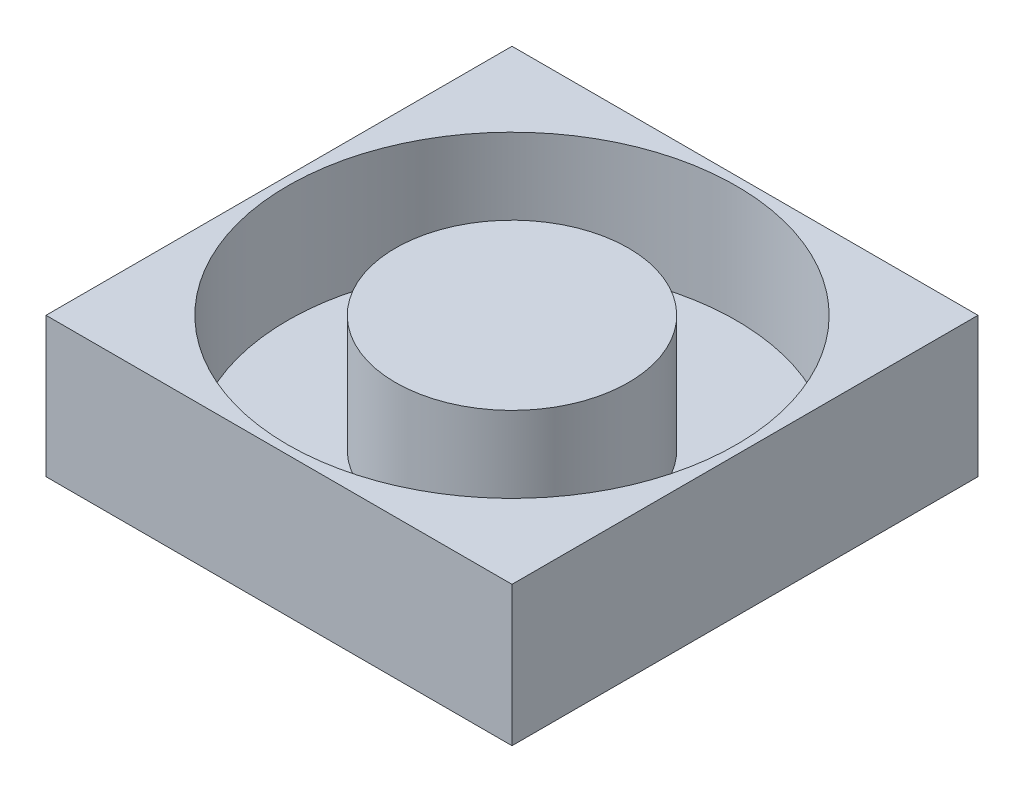
ISO-10303-21;
HEADER;
FILE_DESCRIPTION(('STEP AP214'),'2;1');
FILE_NAME('part.step','',(''),(''),'','','');
FILE_SCHEMA(('AUTOMOTIVE_DESIGN { 1 0 10303 214 1 1 1 1 }'));
ENDSEC;
DATA;
#1=APPLICATION_CONTEXT('core data for automotive mechanical design processes');
#2=APPLICATION_PROTOCOL_DEFINITION('international standard','automotive_design',2000,#1);
#3=PRODUCT_CONTEXT('',#1,'mechanical');
#4=PRODUCT('Part','Part','',(#3));
#5=PRODUCT_RELATED_PRODUCT_CATEGORY('part','',(#4));
#6=PRODUCT_DEFINITION_FORMATION('','',#4);
#7=PRODUCT_DEFINITION_CONTEXT('part definition',#1,'design');
#8=PRODUCT_DEFINITION('design','',#6,#7);
#9=PRODUCT_DEFINITION_SHAPE('','',#8);
#10=(LENGTH_UNIT() NAMED_UNIT(*) SI_UNIT(.MILLI.,.METRE.));
#11=(NAMED_UNIT(*) PLANE_ANGLE_UNIT() SI_UNIT($,.RADIAN.));
#12=(NAMED_UNIT(*) SI_UNIT($,.STERADIAN.) SOLID_ANGLE_UNIT());
#13=UNCERTAINTY_MEASURE_WITH_UNIT(LENGTH_MEASURE(1.E-05),#10,'distance_accuracy_value','');
#14=(GEOMETRIC_REPRESENTATION_CONTEXT(3) GLOBAL_UNCERTAINTY_ASSIGNED_CONTEXT((#13)) GLOBAL_UNIT_ASSIGNED_CONTEXT((#10,
#11,#12)) REPRESENTATION_CONTEXT('',''));
#15=CARTESIAN_POINT('',(0.,0.,0.));
#16=DIRECTION('',(0.,0.,1.));
#17=DIRECTION('',(1.,0.,0.));
#18=AXIS2_PLACEMENT_3D('',#15,#16,#17);
#19=CARTESIAN_POINT('',(0.,12.,0.));
#20=DIRECTION('',(1.,0.,0.));
#21=DIRECTION('',(0.,0.,-1.));
#22=AXIS2_PLACEMENT_3D('',#19,#20,#21);
#23=PLANE('',#22);
#24=DIRECTION('',(0.,0.,1.));
#25=VECTOR('',#24,1.);
#26=CARTESIAN_POINT('',(0.,0.,0.));
#27=LINE('',#26,#25);
#28=CARTESIAN_POINT('',(0.,0.,0.));
#29=VERTEX_POINT('',#28);
#30=CARTESIAN_POINT('',(0.,0.,40.));
#31=VERTEX_POINT('',#30);
#32=EDGE_CURVE('E96',#29,#31,#27,.T.);
#33=ORIENTED_EDGE('',*,*,#32,.T.);
#34=DIRECTION('',(0.,-1.,0.));
#35=VECTOR('',#34,1.);
#36=CARTESIAN_POINT('',(0.,12.,40.));
#37=LINE('',#36,#35);
#38=CARTESIAN_POINT('',(0.,12.,40.));
#39=VERTEX_POINT('',#38);
#40=EDGE_CURVE('E11',#39,#31,#37,.T.);
#41=ORIENTED_EDGE('',*,*,#40,.F.);
#42=DIRECTION('',(0.,0.,1.));
#43=VECTOR('',#42,1.);
#44=CARTESIAN_POINT('',(0.,12.,0.));
#45=LINE('',#44,#43);
#46=CARTESIAN_POINT('',(0.,12.,0.));
#47=VERTEX_POINT('',#46);
#48=EDGE_CURVE('E84',#47,#39,#45,.T.);
#49=ORIENTED_EDGE('',*,*,#48,.F.);
#50=DIRECTION('',(0.,-1.,0.));
#51=VECTOR('',#50,1.);
#52=CARTESIAN_POINT('',(0.,12.,0.));
#53=LINE('',#52,#51);
#54=EDGE_CURVE('E92',#47,#29,#53,.T.);
#55=ORIENTED_EDGE('',*,*,#54,.T.);
#56=EDGE_LOOP('',(#33,#41,#49,#55));
#57=FACE_BOUND('',#56,.T.);
#58=ADVANCED_FACE('F33',(#57),#23,.F.);
#59=CARTESIAN_POINT('',(0.,12.,40.));
#60=DIRECTION('',(0.,0.,-1.));
#61=DIRECTION('',(-1.,0.,0.));
#62=AXIS2_PLACEMENT_3D('',#59,#60,#61);
#63=PLANE('',#62);
#64=DIRECTION('',(1.,0.,0.));
#65=VECTOR('',#64,1.);
#66=CARTESIAN_POINT('',(0.,0.,40.));
#67=LINE('',#66,#65);
#68=CARTESIAN_POINT('',(40.,0.,40.));
#69=VERTEX_POINT('',#68);
#70=EDGE_CURVE('E88',#31,#69,#67,.T.);
#71=ORIENTED_EDGE('',*,*,#70,.T.);
#72=DIRECTION('',(0.,-1.,0.));
#73=VECTOR('',#72,1.);
#74=CARTESIAN_POINT('',(40.,12.,40.));
#75=LINE('',#74,#73);
#76=CARTESIAN_POINT('',(40.,12.,40.));
#77=VERTEX_POINT('',#76);
#78=EDGE_CURVE('E41',#77,#69,#75,.T.);
#79=ORIENTED_EDGE('',*,*,#78,.F.);
#80=DIRECTION('',(1.,0.,0.));
#81=VECTOR('',#80,1.);
#82=CARTESIAN_POINT('',(0.,12.,40.));
#83=LINE('',#82,#81);
#84=EDGE_CURVE('E79',#39,#77,#83,.T.);
#85=ORIENTED_EDGE('',*,*,#84,.F.);
#86=ORIENTED_EDGE('',*,*,#40,.T.);
#87=EDGE_LOOP('',(#71,#79,#85,#86));
#88=FACE_BOUND('',#87,.T.);
#89=ADVANCED_FACE('F87',(#88),#63,.F.);
#90=CARTESIAN_POINT('',(40.,12.,0.));
#91=DIRECTION('',(-1.,0.,0.));
#92=DIRECTION('',(0.,0.,1.));
#93=AXIS2_PLACEMENT_3D('',#90,#91,#92);
#94=PLANE('',#93);
#95=DIRECTION('',(0.,0.,-1.));
#96=VECTOR('',#95,1.);
#97=CARTESIAN_POINT('',(40.,0.,0.));
#98=LINE('',#97,#96);
#99=CARTESIAN_POINT('',(40.,0.,0.));
#100=VERTEX_POINT('',#99);
#101=EDGE_CURVE('E66',#69,#100,#98,.T.);
#102=ORIENTED_EDGE('',*,*,#101,.T.);
#103=DIRECTION('',(0.,-1.,0.));
#104=VECTOR('',#103,1.);
#105=CARTESIAN_POINT('',(40.,12.,0.));
#106=LINE('',#105,#104);
#107=CARTESIAN_POINT('',(40.,12.,0.));
#108=VERTEX_POINT('',#107);
#109=EDGE_CURVE('E89',#108,#100,#106,.T.);
#110=ORIENTED_EDGE('',*,*,#109,.F.);
#111=DIRECTION('',(0.,0.,-1.));
#112=VECTOR('',#111,1.);
#113=CARTESIAN_POINT('',(40.,12.,0.));
#114=LINE('',#113,#112);
#115=EDGE_CURVE('E82',#77,#108,#114,.T.);
#116=ORIENTED_EDGE('',*,*,#115,.F.);
#117=ORIENTED_EDGE('',*,*,#78,.T.);
#118=EDGE_LOOP('',(#102,#110,#116,#117));
#119=FACE_BOUND('',#118,.T.);
#120=ADVANCED_FACE('F90',(#119),#94,.F.);
#121=CARTESIAN_POINT('',(0.,12.,0.));
#122=DIRECTION('',(0.,0.,1.));
#123=DIRECTION('',(1.,0.,0.));
#124=AXIS2_PLACEMENT_3D('',#121,#122,#123);
#125=PLANE('',#124);
#126=DIRECTION('',(-1.,0.,0.));
#127=VECTOR('',#126,1.);
#128=CARTESIAN_POINT('',(0.,0.,0.));
#129=LINE('',#128,#127);
#130=EDGE_CURVE('E72',#100,#29,#129,.T.);
#131=ORIENTED_EDGE('',*,*,#130,.T.);
#132=ORIENTED_EDGE('',*,*,#54,.F.);
#133=DIRECTION('',(-1.,0.,0.));
#134=VECTOR('',#133,1.);
#135=CARTESIAN_POINT('',(0.,12.,0.));
#136=LINE('',#135,#134);
#137=EDGE_CURVE('E49',#108,#47,#136,.T.);
#138=ORIENTED_EDGE('',*,*,#137,.F.);
#139=ORIENTED_EDGE('',*,*,#109,.T.);
#140=EDGE_LOOP('',(#131,#132,#138,#139));
#141=FACE_BOUND('',#140,.T.);
#142=ADVANCED_FACE('F104',(#141),#125,.F.);
#143=CARTESIAN_POINT('',(0.,12.,0.));
#144=DIRECTION('',(0.,1.,0.));
#145=DIRECTION('',(0.,0.,1.));
#146=AXIS2_PLACEMENT_3D('',#143,#144,#145);
#147=PLANE('',#146);
#148=CARTESIAN_POINT('',(20.,12.,20.));
#149=DIRECTION('',(0.,1.,0.));
#150=DIRECTION('',(0.,0.,1.));
#151=AXIS2_PLACEMENT_3D('',#148,#149,#150);
#152=CIRCLE('',#151,19.25);
#153=CARTESIAN_POINT('',(20.,12.,39.25));
#154=VERTEX_POINT('',#153);
#155=EDGE_CURVE('E110',#154,#154,#152,.T.);
#156=ORIENTED_EDGE('',*,*,#155,.F.);
#157=EDGE_LOOP('',(#156));
#158=FACE_BOUND('',#157,.T.);
#159=ORIENTED_EDGE('',*,*,#48,.T.);
#160=ORIENTED_EDGE('',*,*,#84,.T.);
#161=ORIENTED_EDGE('',*,*,#115,.T.);
#162=ORIENTED_EDGE('',*,*,#137,.T.);
#163=EDGE_LOOP('',(#159,#160,#161,#162));
#164=FACE_BOUND('',#163,.T.);
#165=ADVANCED_FACE('F80',(#158,#164),#147,.T.);
#166=CARTESIAN_POINT('',(0.,0.,0.));
#167=DIRECTION('',(0.,1.,0.));
#168=DIRECTION('',(0.,0.,1.));
#169=AXIS2_PLACEMENT_3D('',#166,#167,#168);
#170=PLANE('',#169);
#171=ORIENTED_EDGE('',*,*,#32,.F.);
#172=ORIENTED_EDGE('',*,*,#130,.F.);
#173=ORIENTED_EDGE('',*,*,#101,.F.);
#174=ORIENTED_EDGE('',*,*,#70,.F.);
#175=EDGE_LOOP('',(#171,#172,#173,#174));
#176=FACE_BOUND('',#175,.T.);
#177=ADVANCED_FACE('F107',(#176),#170,.F.);
#178=CARTESIAN_POINT('',(20.,2.,20.));
#179=DIRECTION('',(0.,1.,0.));
#180=DIRECTION('',(0.,0.,1.));
#181=AXIS2_PLACEMENT_3D('',#178,#179,#180);
#182=CYLINDRICAL_SURFACE('',#181,19.25);
#183=CARTESIAN_POINT('',(20.,2.,20.));
#184=DIRECTION('',(0.,1.,0.));
#185=DIRECTION('',(0.,0.,1.));
#186=AXIS2_PLACEMENT_3D('',#183,#184,#185);
#187=CIRCLE('',#186,19.25);
#188=CARTESIAN_POINT('',(20.,2.,39.25));
#189=VERTEX_POINT('',#188);
#190=EDGE_CURVE('E99',#189,#189,#187,.T.);
#191=ORIENTED_EDGE('',*,*,#190,.F.);
#192=EDGE_LOOP('',(#191));
#193=FACE_BOUND('',#192,.T.);
#194=ORIENTED_EDGE('',*,*,#155,.T.);
#195=EDGE_LOOP('',(#194));
#196=FACE_BOUND('',#195,.T.);
#197=ADVANCED_FACE('F128',(#193,#196),#182,.F.);
#198=CARTESIAN_POINT('',(20.,2.,20.));
#199=DIRECTION('',(0.,1.,0.));
#200=DIRECTION('',(0.,0.,1.));
#201=AXIS2_PLACEMENT_3D('',#198,#199,#200);
#202=PLANE('',#201);
#203=CARTESIAN_POINT('',(20.,2.,20.));
#204=DIRECTION('',(0.,1.,0.));
#205=DIRECTION('',(0.,0.,1.));
#206=AXIS2_PLACEMENT_3D('',#203,#204,#205);
#207=CIRCLE('',#206,10.);
#208=CARTESIAN_POINT('',(20.,2.,30.));
#209=VERTEX_POINT('',#208);
#210=EDGE_CURVE('E113',#209,#209,#207,.T.);
#211=ORIENTED_EDGE('',*,*,#210,.F.);
#212=EDGE_LOOP('',(#211));
#213=FACE_BOUND('',#212,.T.);
#214=ORIENTED_EDGE('',*,*,#190,.T.);
#215=EDGE_LOOP('',(#214));
#216=FACE_BOUND('',#215,.T.);
#217=ADVANCED_FACE('F125',(#213,#216),#202,.T.);
#218=CARTESIAN_POINT('',(20.,2.,20.));
#219=DIRECTION('',(0.,1.,0.));
#220=DIRECTION('',(0.,0.,1.));
#221=AXIS2_PLACEMENT_3D('',#218,#219,#220);
#222=CYLINDRICAL_SURFACE('',#221,10.);
#223=ORIENTED_EDGE('',*,*,#210,.T.);
#224=EDGE_LOOP('',(#223));
#225=FACE_BOUND('',#224,.T.);
#226=CARTESIAN_POINT('',(20.,12.,20.));
#227=DIRECTION('',(0.,1.,0.));
#228=DIRECTION('',(0.,0.,1.));
#229=AXIS2_PLACEMENT_3D('',#226,#227,#228);
#230=CIRCLE('',#229,10.);
#231=CARTESIAN_POINT('',(20.,12.,30.));
#232=VERTEX_POINT('',#231);
#233=EDGE_CURVE('E116',#232,#232,#230,.T.);
#234=ORIENTED_EDGE('',*,*,#233,.F.);
#235=EDGE_LOOP('',(#234));
#236=FACE_BOUND('',#235,.T.);
#237=ADVANCED_FACE('F122',(#225,#236),#222,.T.);
#238=ORIENTED_EDGE('',*,*,#233,.T.);
#239=EDGE_LOOP('',(#238));
#240=FACE_BOUND('',#239,.T.);
#241=ADVANCED_FACE('F139',(#240),#147,.T.);
#242=CLOSED_SHELL('',(#58,#89,#120,#142,#165,#177,#197,#217,#237,#241));
#243=MANIFOLD_SOLID_BREP('B2',#242);
#244=ADVANCED_BREP_SHAPE_REPRESENTATION('',(#18,#243),#14);
#245=SHAPE_DEFINITION_REPRESENTATION(#9,#244);
ENDSEC;
END-ISO-10303-21;
